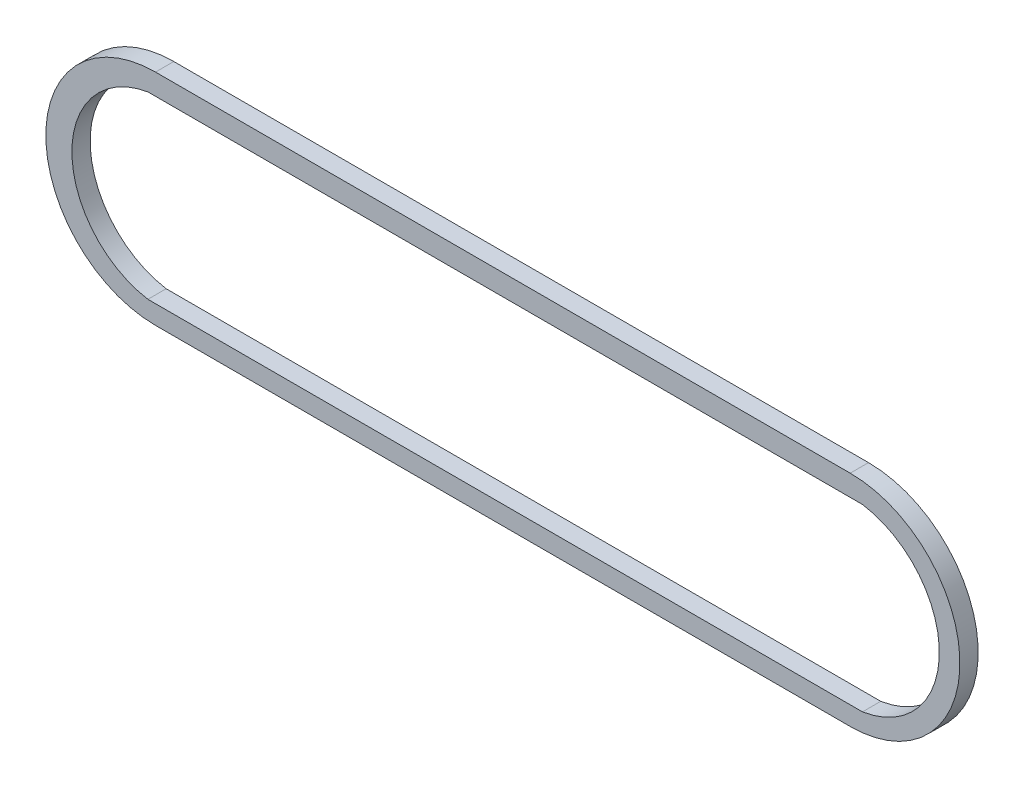
ISO-10303-21;
HEADER;
FILE_DESCRIPTION(('STEP AP214'),'2;1');
FILE_NAME('part.step','',(''),(''),'','','');
FILE_SCHEMA(('AUTOMOTIVE_DESIGN { 1 0 10303 214 1 1 1 1 }'));
ENDSEC;
DATA;
#1=APPLICATION_CONTEXT('core data for automotive mechanical design processes');
#2=APPLICATION_PROTOCOL_DEFINITION('international standard','automotive_design',2000,#1);
#3=PRODUCT_CONTEXT('',#1,'mechanical');
#4=PRODUCT('Part','Part','',(#3));
#5=PRODUCT_RELATED_PRODUCT_CATEGORY('part','',(#4));
#6=PRODUCT_DEFINITION_FORMATION('','',#4);
#7=PRODUCT_DEFINITION_CONTEXT('part definition',#1,'design');
#8=PRODUCT_DEFINITION('design','',#6,#7);
#9=PRODUCT_DEFINITION_SHAPE('','',#8);
#10=(LENGTH_UNIT() NAMED_UNIT(*) SI_UNIT(.MILLI.,.METRE.));
#11=(NAMED_UNIT(*) PLANE_ANGLE_UNIT() SI_UNIT($,.RADIAN.));
#12=(NAMED_UNIT(*) SI_UNIT($,.STERADIAN.) SOLID_ANGLE_UNIT());
#13=UNCERTAINTY_MEASURE_WITH_UNIT(LENGTH_MEASURE(1.E-05),#10,'distance_accuracy_value','');
#14=(GEOMETRIC_REPRESENTATION_CONTEXT(3) GLOBAL_UNCERTAINTY_ASSIGNED_CONTEXT((#13)) GLOBAL_UNIT_ASSIGNED_CONTEXT((#10,
#11,#12)) REPRESENTATION_CONTEXT('',''));
#15=CARTESIAN_POINT('',(0.,0.,0.));
#16=DIRECTION('',(0.,0.,1.));
#17=DIRECTION('',(1.,0.,0.));
#18=AXIS2_PLACEMENT_3D('',#15,#16,#17);
#19=CARTESIAN_POINT('',(366.447257931767,35.7869855303332,0.));
#20=DIRECTION('',(0.,0.,-1.));
#21=DIRECTION('',(-1.,0.,0.));
#22=AXIS2_PLACEMENT_3D('',#19,#20,#21);
#23=CYLINDRICAL_SURFACE('',#22,60.);
#24=DIRECTION('',(0.,0.,-1.));
#25=VECTOR('',#24,1.);
#26=CARTESIAN_POINT('',(366.447257931767,-24.2130144696668,10.));
#27=LINE('',#26,#25);
#28=CARTESIAN_POINT('',(366.447257931767,-24.2130144696668,0.));
#29=VERTEX_POINT('',#28);
#30=CARTESIAN_POINT('',(366.447257931767,-24.2130144696668,10.));
#31=VERTEX_POINT('',#30);
#32=EDGE_CURVE('E157',#29,#31,#27,.F.);
#33=ORIENTED_EDGE('',*,*,#32,.F.);
#34=CARTESIAN_POINT('',(366.447257931767,35.7869855303332,0.));
#35=DIRECTION('',(0.,0.,-1.));
#36=DIRECTION('',(-1.,0.,0.));
#37=AXIS2_PLACEMENT_3D('',#34,#35,#36);
#38=CIRCLE('',#37,60.);
#39=CARTESIAN_POINT('',(366.447257931767,95.7869855303332,0.));
#40=VERTEX_POINT('',#39);
#41=EDGE_CURVE('E44',#40,#29,#38,.T.);
#42=ORIENTED_EDGE('',*,*,#41,.F.);
#43=DIRECTION('',(0.,0.,-1.));
#44=VECTOR('',#43,1.);
#45=CARTESIAN_POINT('',(366.447257931767,95.7869855303332,10.));
#46=LINE('',#45,#44);
#47=CARTESIAN_POINT('',(366.447257931767,95.7869855303332,10.));
#48=VERTEX_POINT('',#47);
#49=EDGE_CURVE('E160',#48,#40,#46,.T.);
#50=ORIENTED_EDGE('',*,*,#49,.F.);
#51=CARTESIAN_POINT('',(366.447257931767,35.7869855303332,10.));
#52=DIRECTION('',(0.,0.,-1.));
#53=DIRECTION('',(-1.,0.,0.));
#54=AXIS2_PLACEMENT_3D('',#51,#52,#53);
#55=CIRCLE('',#54,60.);
#56=EDGE_CURVE('E11',#31,#48,#55,.F.);
#57=ORIENTED_EDGE('',*,*,#56,.F.);
#58=EDGE_LOOP('',(#33,#42,#50,#57));
#59=FACE_BOUND('',#58,.T.);
#60=ADVANCED_FACE('F36',(#59),#23,.T.);
#61=CARTESIAN_POINT('',(-13.5527420682331,35.7869855303332,0.));
#62=DIRECTION('',(0.,0.,-1.));
#63=DIRECTION('',(-1.,0.,0.));
#64=AXIS2_PLACEMENT_3D('',#61,#62,#63);
#65=CYLINDRICAL_SURFACE('',#64,60.);
#66=DIRECTION('',(0.,0.,-1.));
#67=VECTOR('',#66,1.);
#68=CARTESIAN_POINT('',(-13.5527420682331,95.7869855303332,10.));
#69=LINE('',#68,#67);
#70=CARTESIAN_POINT('',(-13.5527420682331,95.7869855303332,0.));
#71=VERTEX_POINT('',#70);
#72=CARTESIAN_POINT('',(-13.5527420682331,95.7869855303332,10.));
#73=VERTEX_POINT('',#72);
#74=EDGE_CURVE('E143',#71,#73,#69,.F.);
#75=ORIENTED_EDGE('',*,*,#74,.F.);
#76=CARTESIAN_POINT('',(-13.5527420682331,35.7869855303332,0.));
#77=DIRECTION('',(0.,0.,-1.));
#78=DIRECTION('',(-1.,0.,0.));
#79=AXIS2_PLACEMENT_3D('',#76,#77,#78);
#80=CIRCLE('',#79,60.);
#81=CARTESIAN_POINT('',(-13.5527420682331,-24.2130144696668,0.));
#82=VERTEX_POINT('',#81);
#83=EDGE_CURVE('E152',#82,#71,#80,.T.);
#84=ORIENTED_EDGE('',*,*,#83,.F.);
#85=DIRECTION('',(0.,0.,-1.));
#86=VECTOR('',#85,1.);
#87=CARTESIAN_POINT('',(-13.5527420682331,-24.2130144696668,10.));
#88=LINE('',#87,#86);
#89=CARTESIAN_POINT('',(-13.5527420682331,-24.2130144696668,10.));
#90=VERTEX_POINT('',#89);
#91=EDGE_CURVE('E149',#90,#82,#88,.T.);
#92=ORIENTED_EDGE('',*,*,#91,.F.);
#93=CARTESIAN_POINT('',(-13.5527420682331,35.7869855303332,10.));
#94=DIRECTION('',(0.,0.,-1.));
#95=DIRECTION('',(-1.,0.,0.));
#96=AXIS2_PLACEMENT_3D('',#93,#94,#95);
#97=CIRCLE('',#96,60.);
#98=EDGE_CURVE('E155',#73,#90,#97,.F.);
#99=ORIENTED_EDGE('',*,*,#98,.F.);
#100=EDGE_LOOP('',(#75,#84,#92,#99));
#101=FACE_BOUND('',#100,.T.);
#102=ADVANCED_FACE('F174',(#101),#65,.T.);
#103=CARTESIAN_POINT('',(-73.5527420682331,-24.2130144696668,10.));
#104=DIRECTION('',(0.,1.,0.));
#105=DIRECTION('',(0.,0.,1.));
#106=AXIS2_PLACEMENT_3D('',#103,#104,#105);
#107=PLANE('',#106);
#108=DIRECTION('',(1.,0.,0.));
#109=VECTOR('',#108,1.);
#110=CARTESIAN_POINT('',(-73.5527420682331,-24.2130144696668,0.));
#111=LINE('',#110,#109);
#112=EDGE_CURVE('E133',#82,#29,#111,.T.);
#113=ORIENTED_EDGE('',*,*,#112,.T.);
#114=ORIENTED_EDGE('',*,*,#32,.T.);
#115=DIRECTION('',(1.,0.,0.));
#116=VECTOR('',#115,1.);
#117=CARTESIAN_POINT('',(-73.5527420682331,-24.2130144696668,10.));
#118=LINE('',#117,#116);
#119=EDGE_CURVE('E137',#90,#31,#118,.T.);
#120=ORIENTED_EDGE('',*,*,#119,.F.);
#121=ORIENTED_EDGE('',*,*,#91,.T.);
#122=EDGE_LOOP('',(#113,#114,#120,#121));
#123=FACE_BOUND('',#122,.T.);
#124=ADVANCED_FACE('F169',(#123),#107,.F.);
#125=CARTESIAN_POINT('',(-73.5527420682331,95.7869855303332,10.));
#126=DIRECTION('',(0.,-1.,0.));
#127=DIRECTION('',(0.,0.,-1.));
#128=AXIS2_PLACEMENT_3D('',#125,#126,#127);
#129=PLANE('',#128);
#130=DIRECTION('',(-1.,0.,0.));
#131=VECTOR('',#130,1.);
#132=CARTESIAN_POINT('',(-73.5527420682331,95.7869855303332,10.));
#133=LINE('',#132,#131);
#134=EDGE_CURVE('E140',#48,#73,#133,.T.);
#135=ORIENTED_EDGE('',*,*,#134,.F.);
#136=ORIENTED_EDGE('',*,*,#49,.T.);
#137=DIRECTION('',(-1.,0.,0.));
#138=VECTOR('',#137,1.);
#139=CARTESIAN_POINT('',(-73.5527420682331,95.7869855303332,0.));
#140=LINE('',#139,#138);
#141=EDGE_CURVE('E141',#40,#71,#140,.T.);
#142=ORIENTED_EDGE('',*,*,#141,.T.);
#143=ORIENTED_EDGE('',*,*,#74,.T.);
#144=EDGE_LOOP('',(#135,#136,#142,#143));
#145=FACE_BOUND('',#144,.T.);
#146=ADVANCED_FACE('F177',(#145),#129,.F.);
#147=CARTESIAN_POINT('',(0.,0.,10.));
#148=DIRECTION('',(0.,0.,-1.));
#149=DIRECTION('',(-1.,0.,0.));
#150=AXIS2_PLACEMENT_3D('',#147,#148,#149);
#151=PLANE('',#150);
#152=DIRECTION('',(1.,0.,0.));
#153=VECTOR('',#152,1.);
#154=CARTESIAN_POINT('',(-17.7159970562988,-13.9310566664272,10.));
#155=LINE('',#154,#153);
#156=CARTESIAN_POINT('',(-17.7159970562988,-13.9310566664272,10.));
#157=VERTEX_POINT('',#156);
#158=CARTESIAN_POINT('',(373.15300485538,-13.9310566664272,10.));
#159=VERTEX_POINT('',#158);
#160=EDGE_CURVE('E127',#157,#159,#155,.T.);
#161=ORIENTED_EDGE('',*,*,#160,.F.);
#162=CARTESIAN_POINT('',(-9.49533947641035,35.1860798171833,10.));
#163=DIRECTION('',(0.,0.,1.));
#164=DIRECTION('',(1.,0.,0.));
#165=AXIS2_PLACEMENT_3D('',#162,#163,#164);
#166=CIRCLE('',#165,49.8003243703833);
#167=CARTESIAN_POINT('',(-17.7159970562988,84.3032163007937,10.));
#168=VERTEX_POINT('',#167);
#169=EDGE_CURVE('E51',#168,#157,#166,.T.);
#170=ORIENTED_EDGE('',*,*,#169,.F.);
#171=DIRECTION('',(-1.,0.,0.));
#172=VECTOR('',#171,1.);
#173=CARTESIAN_POINT('',(-17.7159970562988,84.3032163007937,10.));
#174=LINE('',#173,#172);
#175=CARTESIAN_POINT('',(373.15300485538,84.3032163007937,10.));
#176=VERTEX_POINT('',#175);
#177=EDGE_CURVE('E118',#176,#168,#174,.T.);
#178=ORIENTED_EDGE('',*,*,#177,.F.);
#179=CARTESIAN_POINT('',(365.477209437294,35.1860798171833,10.));
#180=DIRECTION('',(0.,0.,1.));
#181=DIRECTION('',(-1.,0.,0.));
#182=AXIS2_PLACEMENT_3D('',#179,#180,#181);
#183=CIRCLE('',#182,49.7132872746305);
#184=EDGE_CURVE('E121',#159,#176,#183,.T.);
#185=ORIENTED_EDGE('',*,*,#184,.F.);
#186=EDGE_LOOP('',(#161,#170,#178,#185));
#187=FACE_BOUND('',#186,.T.);
#188=ORIENTED_EDGE('',*,*,#119,.T.);
#189=ORIENTED_EDGE('',*,*,#56,.T.);
#190=ORIENTED_EDGE('',*,*,#134,.T.);
#191=ORIENTED_EDGE('',*,*,#98,.T.);
#192=EDGE_LOOP('',(#188,#189,#190,#191));
#193=FACE_BOUND('',#192,.T.);
#194=ADVANCED_FACE('F179',(#187,#193),#151,.F.);
#195=CARTESIAN_POINT('',(0.,0.,0.));
#196=DIRECTION('',(0.,0.,-1.));
#197=DIRECTION('',(-1.,0.,0.));
#198=AXIS2_PLACEMENT_3D('',#195,#196,#197);
#199=PLANE('',#198);
#200=CARTESIAN_POINT('',(-9.49533947641035,35.1860798171833,0.));
#201=DIRECTION('',(0.,0.,1.));
#202=DIRECTION('',(1.,0.,0.));
#203=AXIS2_PLACEMENT_3D('',#200,#201,#202);
#204=CIRCLE('',#203,49.8003243703833);
#205=CARTESIAN_POINT('',(-17.7159970562988,84.3032163007937,0.));
#206=VERTEX_POINT('',#205);
#207=CARTESIAN_POINT('',(-17.7159970562988,-13.9310566664272,0.));
#208=VERTEX_POINT('',#207);
#209=EDGE_CURVE('E102',#206,#208,#204,.T.);
#210=ORIENTED_EDGE('',*,*,#209,.T.);
#211=DIRECTION('',(1.,0.,0.));
#212=VECTOR('',#211,1.);
#213=CARTESIAN_POINT('',(-17.7159970562988,-13.9310566664272,0.));
#214=LINE('',#213,#212);
#215=CARTESIAN_POINT('',(373.15300485538,-13.9310566664272,0.));
#216=VERTEX_POINT('',#215);
#217=EDGE_CURVE('E111',#208,#216,#214,.T.);
#218=ORIENTED_EDGE('',*,*,#217,.T.);
#219=CARTESIAN_POINT('',(365.477209437294,35.1860798171833,0.));
#220=DIRECTION('',(0.,0.,1.));
#221=DIRECTION('',(-1.,0.,0.));
#222=AXIS2_PLACEMENT_3D('',#219,#220,#221);
#223=CIRCLE('',#222,49.7132872746305);
#224=CARTESIAN_POINT('',(373.15300485538,84.3032163007937,0.));
#225=VERTEX_POINT('',#224);
#226=EDGE_CURVE('E59',#216,#225,#223,.T.);
#227=ORIENTED_EDGE('',*,*,#226,.T.);
#228=DIRECTION('',(-1.,0.,0.));
#229=VECTOR('',#228,1.);
#230=CARTESIAN_POINT('',(-17.7159970562988,84.3032163007937,0.));
#231=LINE('',#230,#229);
#232=EDGE_CURVE('E108',#225,#206,#231,.T.);
#233=ORIENTED_EDGE('',*,*,#232,.T.);
#234=EDGE_LOOP('',(#210,#218,#227,#233));
#235=FACE_BOUND('',#234,.T.);
#236=ORIENTED_EDGE('',*,*,#141,.F.);
#237=ORIENTED_EDGE('',*,*,#41,.T.);
#238=ORIENTED_EDGE('',*,*,#112,.F.);
#239=ORIENTED_EDGE('',*,*,#83,.T.);
#240=EDGE_LOOP('',(#236,#237,#238,#239));
#241=FACE_BOUND('',#240,.T.);
#242=ADVANCED_FACE('F115',(#235,#241),#199,.T.);
#243=CARTESIAN_POINT('',(-9.49533947641035,35.1860798171833,0.));
#244=DIRECTION('',(0.,0.,1.));
#245=DIRECTION('',(1.,0.,0.));
#246=AXIS2_PLACEMENT_3D('',#243,#244,#245);
#247=CYLINDRICAL_SURFACE('',#246,49.8003243703833);
#248=ORIENTED_EDGE('',*,*,#169,.T.);
#249=DIRECTION('',(0.,0.,1.));
#250=VECTOR('',#249,1.);
#251=CARTESIAN_POINT('',(-17.7159970562988,-13.9310566664272,0.));
#252=LINE('',#251,#250);
#253=EDGE_CURVE('E98',#208,#157,#252,.T.);
#254=ORIENTED_EDGE('',*,*,#253,.F.);
#255=ORIENTED_EDGE('',*,*,#209,.F.);
#256=DIRECTION('',(0.,0.,1.));
#257=VECTOR('',#256,1.);
#258=CARTESIAN_POINT('',(-17.7159970562988,84.3032163007937,0.));
#259=LINE('',#258,#257);
#260=EDGE_CURVE('E131',#206,#168,#259,.T.);
#261=ORIENTED_EDGE('',*,*,#260,.T.);
#262=EDGE_LOOP('',(#248,#254,#255,#261));
#263=FACE_BOUND('',#262,.T.);
#264=ADVANCED_FACE('F100',(#263),#247,.F.);
#265=CARTESIAN_POINT('',(-17.7159970562988,84.3032163007937,0.));
#266=DIRECTION('',(0.,1.,0.));
#267=DIRECTION('',(0.,0.,1.));
#268=AXIS2_PLACEMENT_3D('',#265,#266,#267);
#269=PLANE('',#268);
#270=ORIENTED_EDGE('',*,*,#177,.T.);
#271=ORIENTED_EDGE('',*,*,#260,.F.);
#272=ORIENTED_EDGE('',*,*,#232,.F.);
#273=DIRECTION('',(0.,0.,1.));
#274=VECTOR('',#273,1.);
#275=CARTESIAN_POINT('',(373.15300485538,84.3032163007937,0.));
#276=LINE('',#275,#274);
#277=EDGE_CURVE('E134',#225,#176,#276,.T.);
#278=ORIENTED_EDGE('',*,*,#277,.T.);
#279=EDGE_LOOP('',(#270,#271,#272,#278));
#280=FACE_BOUND('',#279,.T.);
#281=ADVANCED_FACE('F229',(#280),#269,.F.);
#282=CARTESIAN_POINT('',(365.477209437294,35.1860798171833,0.));
#283=DIRECTION('',(0.,0.,1.));
#284=DIRECTION('',(1.,0.,0.));
#285=AXIS2_PLACEMENT_3D('',#282,#283,#284);
#286=CYLINDRICAL_SURFACE('',#285,49.7132872746305);
#287=ORIENTED_EDGE('',*,*,#184,.T.);
#288=ORIENTED_EDGE('',*,*,#277,.F.);
#289=ORIENTED_EDGE('',*,*,#226,.F.);
#290=DIRECTION('',(0.,0.,1.));
#291=VECTOR('',#290,1.);
#292=CARTESIAN_POINT('',(373.15300485538,-13.9310566664272,0.));
#293=LINE('',#292,#291);
#294=EDGE_CURVE('E107',#216,#159,#293,.T.);
#295=ORIENTED_EDGE('',*,*,#294,.T.);
#296=EDGE_LOOP('',(#287,#288,#289,#295));
#297=FACE_BOUND('',#296,.T.);
#298=ADVANCED_FACE('F238',(#297),#286,.F.);
#299=CARTESIAN_POINT('',(-17.7159970562988,-13.9310566664272,0.));
#300=DIRECTION('',(0.,-1.,0.));
#301=DIRECTION('',(0.,0.,-1.));
#302=AXIS2_PLACEMENT_3D('',#299,#300,#301);
#303=PLANE('',#302);
#304=ORIENTED_EDGE('',*,*,#160,.T.);
#305=ORIENTED_EDGE('',*,*,#294,.F.);
#306=ORIENTED_EDGE('',*,*,#217,.F.);
#307=ORIENTED_EDGE('',*,*,#253,.T.);
#308=EDGE_LOOP('',(#304,#305,#306,#307));
#309=FACE_BOUND('',#308,.T.);
#310=ADVANCED_FACE('F112',(#309),#303,.F.);
#311=CLOSED_SHELL('',(#60,#102,#124,#146,#194,#242,#264,#281,#298,#310));
#312=MANIFOLD_SOLID_BREP('B2',#311);
#313=ADVANCED_BREP_SHAPE_REPRESENTATION('',(#18,#312),#14);
#314=SHAPE_DEFINITION_REPRESENTATION(#9,#313);
ENDSEC;
END-ISO-10303-21;
